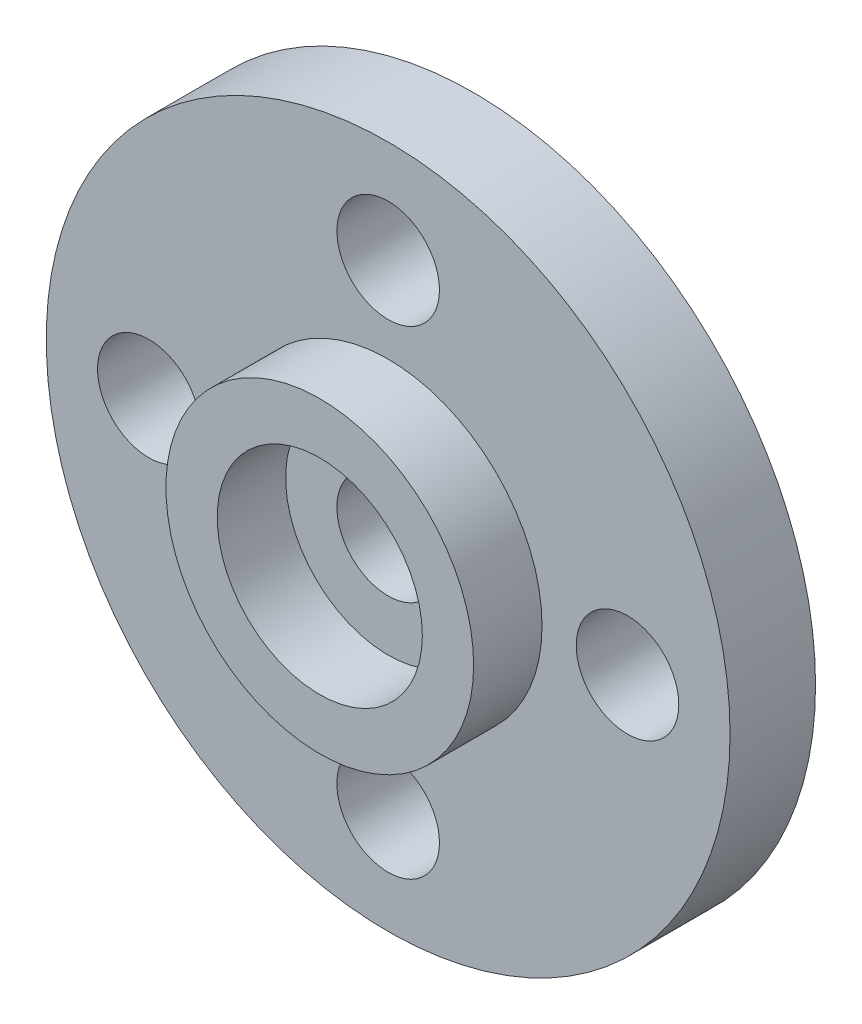
ISO-10303-21;
HEADER;
FILE_DESCRIPTION(('STEP AP214'),'2;1');
FILE_NAME('part.step','',(''),(''),'','','');
FILE_SCHEMA(('AUTOMOTIVE_DESIGN { 1 0 10303 214 1 1 1 1 }'));
ENDSEC;
DATA;
#1=APPLICATION_CONTEXT('core data for automotive mechanical design processes');
#2=APPLICATION_PROTOCOL_DEFINITION('international standard','automotive_design',2000,#1);
#3=PRODUCT_CONTEXT('',#1,'mechanical');
#4=PRODUCT('Part','Part','',(#3));
#5=PRODUCT_RELATED_PRODUCT_CATEGORY('part','',(#4));
#6=PRODUCT_DEFINITION_FORMATION('','',#4);
#7=PRODUCT_DEFINITION_CONTEXT('part definition',#1,'design');
#8=PRODUCT_DEFINITION('design','',#6,#7);
#9=PRODUCT_DEFINITION_SHAPE('','',#8);
#10=(LENGTH_UNIT() NAMED_UNIT(*) SI_UNIT(.MILLI.,.METRE.));
#11=(NAMED_UNIT(*) PLANE_ANGLE_UNIT() SI_UNIT($,.RADIAN.));
#12=(NAMED_UNIT(*) SI_UNIT($,.STERADIAN.) SOLID_ANGLE_UNIT());
#13=UNCERTAINTY_MEASURE_WITH_UNIT(LENGTH_MEASURE(1.E-05),#10,'distance_accuracy_value','');
#14=(GEOMETRIC_REPRESENTATION_CONTEXT(3) GLOBAL_UNCERTAINTY_ASSIGNED_CONTEXT((#13)) GLOBAL_UNIT_ASSIGNED_CONTEXT((#10,
#11,#12)) REPRESENTATION_CONTEXT('',''));
#15=CARTESIAN_POINT('',(0.,0.,0.));
#16=DIRECTION('',(0.,0.,1.));
#17=DIRECTION('',(1.,0.,0.));
#18=AXIS2_PLACEMENT_3D('',#15,#16,#17);
#19=CARTESIAN_POINT('',(0.,0.,2.5));
#20=DIRECTION('',(0.,0.,1.));
#21=DIRECTION('',(1.,0.,0.));
#22=AXIS2_PLACEMENT_3D('',#19,#20,#21);
#23=PLANE('',#22);
#24=CARTESIAN_POINT('',(0.,0.,2.5));
#25=DIRECTION('',(0.,0.,1.));
#26=DIRECTION('',(1.,0.,0.));
#27=AXIS2_PLACEMENT_3D('',#24,#25,#26);
#28=CIRCLE('',#27,1.5);
#29=CARTESIAN_POINT('',(1.5,0.,2.5));
#30=VERTEX_POINT('',#29);
#31=EDGE_CURVE('E43',#30,#30,#28,.T.);
#32=ORIENTED_EDGE('',*,*,#31,.F.);
#33=EDGE_LOOP('',(#32));
#34=FACE_BOUND('',#33,.T.);
#35=CARTESIAN_POINT('',(0.,0.,2.5));
#36=DIRECTION('',(0.,0.,1.));
#37=DIRECTION('',(1.,0.,0.));
#38=AXIS2_PLACEMENT_3D('',#35,#36,#37);
#39=CIRCLE('',#38,3.);
#40=CARTESIAN_POINT('',(3.,0.,2.5));
#41=VERTEX_POINT('',#40);
#42=EDGE_CURVE('E10',#41,#41,#39,.F.);
#43=ORIENTED_EDGE('',*,*,#42,.F.);
#44=EDGE_LOOP('',(#43));
#45=FACE_BOUND('',#44,.T.);
#46=ADVANCED_FACE('F36',(#34,#45),#23,.T.);
#47=CARTESIAN_POINT('',(0.,0.,2.5));
#48=DIRECTION('',(0.,0.,-1.));
#49=DIRECTION('',(-1.,0.,0.));
#50=AXIS2_PLACEMENT_3D('',#47,#48,#49);
#51=CYLINDRICAL_SURFACE('',#50,10.);
#52=CARTESIAN_POINT('',(0.,0.,2.5));
#53=DIRECTION('',(0.,0.,1.));
#54=DIRECTION('',(1.,0.,0.));
#55=AXIS2_PLACEMENT_3D('',#52,#53,#54);
#56=CIRCLE('',#55,10.);
#57=CARTESIAN_POINT('',(10.,0.,2.5));
#58=VERTEX_POINT('',#57);
#59=EDGE_CURVE('E47',#58,#58,#56,.T.);
#60=ORIENTED_EDGE('',*,*,#59,.F.);
#61=EDGE_LOOP('',(#60));
#62=FACE_BOUND('',#61,.T.);
#63=CARTESIAN_POINT('',(0.,0.,0.));
#64=DIRECTION('',(0.,0.,1.));
#65=DIRECTION('',(1.,0.,0.));
#66=AXIS2_PLACEMENT_3D('',#63,#64,#65);
#67=CIRCLE('',#66,10.);
#68=CARTESIAN_POINT('',(10.,0.,0.));
#69=VERTEX_POINT('',#68);
#70=EDGE_CURVE('E69',#69,#69,#67,.T.);
#71=ORIENTED_EDGE('',*,*,#70,.T.);
#72=EDGE_LOOP('',(#71));
#73=FACE_BOUND('',#72,.T.);
#74=ADVANCED_FACE('F104',(#62,#73),#51,.T.);
#75=CARTESIAN_POINT('',(7.,0.,2.5));
#76=DIRECTION('',(0.,0.,-1.));
#77=DIRECTION('',(-1.,0.,0.));
#78=AXIS2_PLACEMENT_3D('',#75,#76,#77);
#79=CYLINDRICAL_SURFACE('',#78,1.5);
#80=CARTESIAN_POINT('',(7.,0.,2.5));
#81=DIRECTION('',(0.,0.,1.));
#82=DIRECTION('',(1.,0.,0.));
#83=AXIS2_PLACEMENT_3D('',#80,#81,#82);
#84=CIRCLE('',#83,1.5);
#85=CARTESIAN_POINT('',(8.5,0.,2.5));
#86=VERTEX_POINT('',#85);
#87=EDGE_CURVE('E52',#86,#86,#84,.T.);
#88=ORIENTED_EDGE('',*,*,#87,.T.);
#89=EDGE_LOOP('',(#88));
#90=FACE_BOUND('',#89,.T.);
#91=CARTESIAN_POINT('',(7.,0.,0.));
#92=DIRECTION('',(0.,0.,1.));
#93=DIRECTION('',(1.,0.,0.));
#94=AXIS2_PLACEMENT_3D('',#91,#92,#93);
#95=CIRCLE('',#94,1.5);
#96=CARTESIAN_POINT('',(8.5,0.,0.));
#97=VERTEX_POINT('',#96);
#98=EDGE_CURVE('E66',#97,#97,#95,.T.);
#99=ORIENTED_EDGE('',*,*,#98,.F.);
#100=EDGE_LOOP('',(#99));
#101=FACE_BOUND('',#100,.T.);
#102=ADVANCED_FACE('F92',(#90,#101),#79,.F.);
#103=CARTESIAN_POINT('',(0.,7.,2.5));
#104=DIRECTION('',(0.,0.,-1.));
#105=DIRECTION('',(-1.,0.,0.));
#106=AXIS2_PLACEMENT_3D('',#103,#104,#105);
#107=CYLINDRICAL_SURFACE('',#106,1.5);
#108=CARTESIAN_POINT('',(0.,7.,2.5));
#109=DIRECTION('',(0.,0.,1.));
#110=DIRECTION('',(1.,0.,0.));
#111=AXIS2_PLACEMENT_3D('',#108,#109,#110);
#112=CIRCLE('',#111,1.5);
#113=CARTESIAN_POINT('',(1.5,7.,2.5));
#114=VERTEX_POINT('',#113);
#115=EDGE_CURVE('E82',#114,#114,#112,.T.);
#116=ORIENTED_EDGE('',*,*,#115,.T.);
#117=EDGE_LOOP('',(#116));
#118=FACE_BOUND('',#117,.T.);
#119=CARTESIAN_POINT('',(0.,7.,0.));
#120=DIRECTION('',(0.,0.,1.));
#121=DIRECTION('',(1.,0.,0.));
#122=AXIS2_PLACEMENT_3D('',#119,#120,#121);
#123=CIRCLE('',#122,1.5);
#124=CARTESIAN_POINT('',(1.5,7.,0.));
#125=VERTEX_POINT('',#124);
#126=EDGE_CURVE('E63',#125,#125,#123,.T.);
#127=ORIENTED_EDGE('',*,*,#126,.F.);
#128=EDGE_LOOP('',(#127));
#129=FACE_BOUND('',#128,.T.);
#130=ADVANCED_FACE('F152',(#118,#129),#107,.F.);
#131=CARTESIAN_POINT('',(-7.,0.,2.5));
#132=DIRECTION('',(0.,0.,-1.));
#133=DIRECTION('',(-1.,0.,0.));
#134=AXIS2_PLACEMENT_3D('',#131,#132,#133);
#135=CYLINDRICAL_SURFACE('',#134,1.5);
#136=CARTESIAN_POINT('',(-7.,0.,2.5));
#137=DIRECTION('',(0.,0.,1.));
#138=DIRECTION('',(1.,0.,0.));
#139=AXIS2_PLACEMENT_3D('',#136,#137,#138);
#140=CIRCLE('',#139,1.5);
#141=CARTESIAN_POINT('',(-5.5,0.,2.5));
#142=VERTEX_POINT('',#141);
#143=EDGE_CURVE('E77',#142,#142,#140,.T.);
#144=ORIENTED_EDGE('',*,*,#143,.T.);
#145=EDGE_LOOP('',(#144));
#146=FACE_BOUND('',#145,.T.);
#147=CARTESIAN_POINT('',(-7.,0.,0.));
#148=DIRECTION('',(0.,0.,1.));
#149=DIRECTION('',(1.,0.,0.));
#150=AXIS2_PLACEMENT_3D('',#147,#148,#149);
#151=CIRCLE('',#150,1.5);
#152=CARTESIAN_POINT('',(-5.5,0.,0.));
#153=VERTEX_POINT('',#152);
#154=EDGE_CURVE('E59',#153,#153,#151,.T.);
#155=ORIENTED_EDGE('',*,*,#154,.F.);
#156=EDGE_LOOP('',(#155));
#157=FACE_BOUND('',#156,.T.);
#158=ADVANCED_FACE('F155',(#146,#157),#135,.F.);
#159=CARTESIAN_POINT('',(0.,-7.,2.5));
#160=DIRECTION('',(0.,0.,-1.));
#161=DIRECTION('',(-1.,0.,0.));
#162=AXIS2_PLACEMENT_3D('',#159,#160,#161);
#163=CYLINDRICAL_SURFACE('',#162,1.5);
#164=CARTESIAN_POINT('',(0.,-7.,2.5));
#165=DIRECTION('',(0.,0.,1.));
#166=DIRECTION('',(1.,0.,0.));
#167=AXIS2_PLACEMENT_3D('',#164,#165,#166);
#168=CIRCLE('',#167,1.5);
#169=CARTESIAN_POINT('',(1.5,-7.,2.5));
#170=VERTEX_POINT('',#169);
#171=EDGE_CURVE('E73',#170,#170,#168,.T.);
#172=ORIENTED_EDGE('',*,*,#171,.T.);
#173=EDGE_LOOP('',(#172));
#174=FACE_BOUND('',#173,.T.);
#175=CARTESIAN_POINT('',(0.,-7.,0.));
#176=DIRECTION('',(0.,0.,1.));
#177=DIRECTION('',(1.,0.,0.));
#178=AXIS2_PLACEMENT_3D('',#175,#176,#177);
#179=CIRCLE('',#178,1.5);
#180=CARTESIAN_POINT('',(1.5,-7.,0.));
#181=VERTEX_POINT('',#180);
#182=EDGE_CURVE('E56',#181,#181,#179,.T.);
#183=ORIENTED_EDGE('',*,*,#182,.F.);
#184=EDGE_LOOP('',(#183));
#185=FACE_BOUND('',#184,.T.);
#186=ADVANCED_FACE('F38',(#174,#185),#163,.F.);
#187=CARTESIAN_POINT('',(0.,0.,2.5));
#188=DIRECTION('',(0.,0.,-1.));
#189=DIRECTION('',(-1.,0.,0.));
#190=AXIS2_PLACEMENT_3D('',#187,#188,#189);
#191=CYLINDRICAL_SURFACE('',#190,1.5);
#192=ORIENTED_EDGE('',*,*,#31,.T.);
#193=EDGE_LOOP('',(#192));
#194=FACE_BOUND('',#193,.T.);
#195=CARTESIAN_POINT('',(0.,0.,0.));
#196=DIRECTION('',(0.,0.,1.));
#197=DIRECTION('',(1.,0.,0.));
#198=AXIS2_PLACEMENT_3D('',#195,#196,#197);
#199=CIRCLE('',#198,1.5);
#200=CARTESIAN_POINT('',(1.5,0.,0.));
#201=VERTEX_POINT('',#200);
#202=EDGE_CURVE('E71',#201,#201,#199,.T.);
#203=ORIENTED_EDGE('',*,*,#202,.F.);
#204=EDGE_LOOP('',(#203));
#205=FACE_BOUND('',#204,.T.);
#206=ADVANCED_FACE('F99',(#194,#205),#191,.F.);
#207=CARTESIAN_POINT('',(0.,0.,2.5));
#208=DIRECTION('',(0.,0.,1.));
#209=DIRECTION('',(1.,0.,0.));
#210=AXIS2_PLACEMENT_3D('',#207,#208,#209);
#211=CIRCLE('',#210,4.5);
#212=CARTESIAN_POINT('',(4.5,0.,2.5));
#213=VERTEX_POINT('',#212);
#214=EDGE_CURVE('E85',#213,#213,#211,.T.);
#215=ORIENTED_EDGE('',*,*,#214,.F.);
#216=EDGE_LOOP('',(#215));
#217=FACE_BOUND('',#216,.T.);
#218=ORIENTED_EDGE('',*,*,#171,.F.);
#219=EDGE_LOOP('',(#218));
#220=FACE_BOUND('',#219,.T.);
#221=ORIENTED_EDGE('',*,*,#143,.F.);
#222=EDGE_LOOP('',(#221));
#223=FACE_BOUND('',#222,.T.);
#224=ORIENTED_EDGE('',*,*,#115,.F.);
#225=EDGE_LOOP('',(#224));
#226=FACE_BOUND('',#225,.T.);
#227=ORIENTED_EDGE('',*,*,#87,.F.);
#228=EDGE_LOOP('',(#227));
#229=FACE_BOUND('',#228,.T.);
#230=ORIENTED_EDGE('',*,*,#59,.T.);
#231=EDGE_LOOP('',(#230));
#232=FACE_BOUND('',#231,.T.);
#233=ADVANCED_FACE('F95',(#217,#220,#223,#226,#229,#232),#23,.T.);
#234=CARTESIAN_POINT('',(0.,0.,0.));
#235=DIRECTION('',(0.,0.,1.));
#236=DIRECTION('',(1.,0.,0.));
#237=AXIS2_PLACEMENT_3D('',#234,#235,#236);
#238=PLANE('',#237);
#239=ORIENTED_EDGE('',*,*,#182,.T.);
#240=EDGE_LOOP('',(#239));
#241=FACE_BOUND('',#240,.T.);
#242=ORIENTED_EDGE('',*,*,#154,.T.);
#243=EDGE_LOOP('',(#242));
#244=FACE_BOUND('',#243,.T.);
#245=ORIENTED_EDGE('',*,*,#126,.T.);
#246=EDGE_LOOP('',(#245));
#247=FACE_BOUND('',#246,.T.);
#248=ORIENTED_EDGE('',*,*,#98,.T.);
#249=EDGE_LOOP('',(#248));
#250=FACE_BOUND('',#249,.T.);
#251=ORIENTED_EDGE('',*,*,#70,.F.);
#252=EDGE_LOOP('',(#251));
#253=FACE_BOUND('',#252,.T.);
#254=ORIENTED_EDGE('',*,*,#202,.T.);
#255=EDGE_LOOP('',(#254));
#256=FACE_BOUND('',#255,.T.);
#257=ADVANCED_FACE('F98',(#241,#244,#247,#250,#253,#256),#238,.F.);
#258=CARTESIAN_POINT('',(0.,0.,4.5));
#259=DIRECTION('',(0.,0.,1.));
#260=DIRECTION('',(1.,0.,0.));
#261=AXIS2_PLACEMENT_3D('',#258,#259,#260);
#262=PLANE('',#261);
#263=CARTESIAN_POINT('',(0.,0.,4.5));
#264=DIRECTION('',(0.,0.,1.));
#265=DIRECTION('',(1.,0.,0.));
#266=AXIS2_PLACEMENT_3D('',#263,#264,#265);
#267=CIRCLE('',#266,4.5);
#268=CARTESIAN_POINT('',(4.5,0.,4.5));
#269=VERTEX_POINT('',#268);
#270=EDGE_CURVE('E60',#269,#269,#267,.T.);
#271=ORIENTED_EDGE('',*,*,#270,.T.);
#272=EDGE_LOOP('',(#271));
#273=FACE_BOUND('',#272,.T.);
#274=CARTESIAN_POINT('',(0.,0.,4.5));
#275=DIRECTION('',(0.,0.,1.));
#276=DIRECTION('',(1.,0.,0.));
#277=AXIS2_PLACEMENT_3D('',#274,#275,#276);
#278=CIRCLE('',#277,3.);
#279=CARTESIAN_POINT('',(3.,0.,4.5));
#280=VERTEX_POINT('',#279);
#281=EDGE_CURVE('E138',#280,#280,#278,.T.);
#282=ORIENTED_EDGE('',*,*,#281,.F.);
#283=EDGE_LOOP('',(#282));
#284=FACE_BOUND('',#283,.T.);
#285=ADVANCED_FACE('F111',(#273,#284),#262,.T.);
#286=CARTESIAN_POINT('',(0.,0.,4.5));
#287=DIRECTION('',(0.,0.,-1.));
#288=DIRECTION('',(-1.,0.,0.));
#289=AXIS2_PLACEMENT_3D('',#286,#287,#288);
#290=CYLINDRICAL_SURFACE('',#289,4.5);
#291=ORIENTED_EDGE('',*,*,#270,.F.);
#292=EDGE_LOOP('',(#291));
#293=FACE_BOUND('',#292,.T.);
#294=ORIENTED_EDGE('',*,*,#214,.T.);
#295=EDGE_LOOP('',(#294));
#296=FACE_BOUND('',#295,.T.);
#297=ADVANCED_FACE('F117',(#293,#296),#290,.T.);
#298=CARTESIAN_POINT('',(0.,0.,4.5));
#299=DIRECTION('',(0.,0.,-1.));
#300=DIRECTION('',(-1.,0.,0.));
#301=AXIS2_PLACEMENT_3D('',#298,#299,#300);
#302=CYLINDRICAL_SURFACE('',#301,3.);
#303=ORIENTED_EDGE('',*,*,#281,.T.);
#304=EDGE_LOOP('',(#303));
#305=FACE_BOUND('',#304,.T.);
#306=ORIENTED_EDGE('',*,*,#42,.T.);
#307=EDGE_LOOP('',(#306));
#308=FACE_BOUND('',#307,.T.);
#309=ADVANCED_FACE('F129',(#305,#308),#302,.F.);
#310=CLOSED_SHELL('',(#46,#74,#102,#130,#158,#186,#206,#233,#257,#285,#297,#309));
#311=MANIFOLD_SOLID_BREP('B2',#310);
#312=ADVANCED_BREP_SHAPE_REPRESENTATION('',(#18,#311),#14);
#313=SHAPE_DEFINITION_REPRESENTATION(#9,#312);
ENDSEC;
END-ISO-10303-21;
